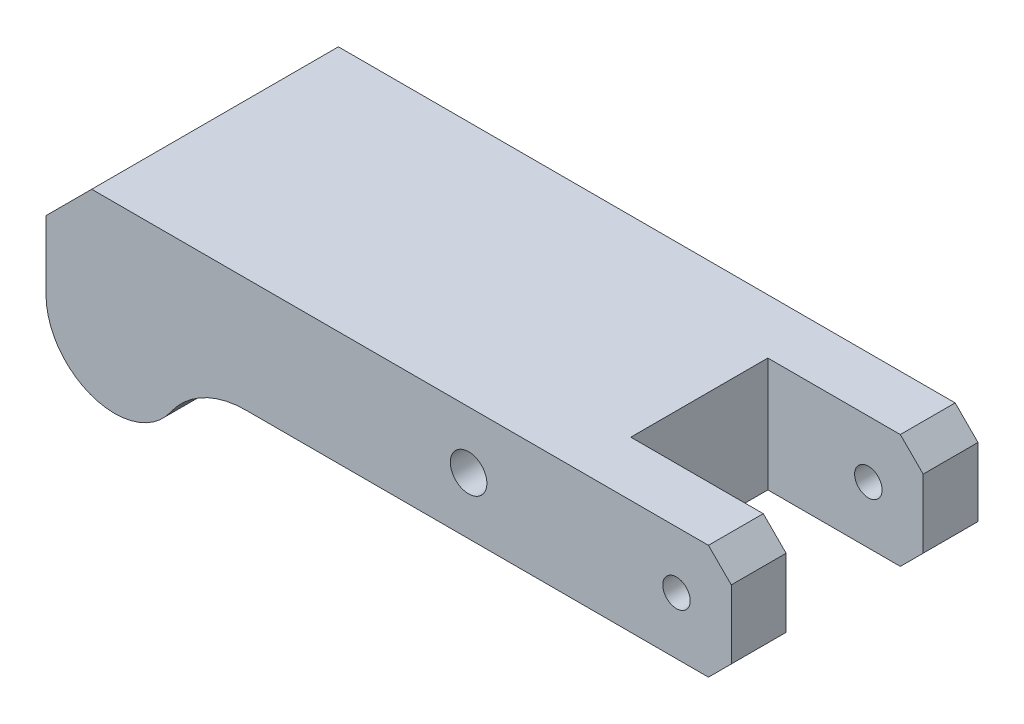
ISO-10303-21;
HEADER;
FILE_DESCRIPTION(('STEP AP214'),'2;1');
FILE_NAME('part.step','',(''),(''),'','','');
FILE_SCHEMA(('AUTOMOTIVE_DESIGN { 1 0 10303 214 1 1 1 1 }'));
ENDSEC;
DATA;
#1=APPLICATION_CONTEXT('core data for automotive mechanical design processes');
#2=APPLICATION_PROTOCOL_DEFINITION('international standard','automotive_design',2000,#1);
#3=PRODUCT_CONTEXT('',#1,'mechanical');
#4=PRODUCT('Part','Part','',(#3));
#5=PRODUCT_RELATED_PRODUCT_CATEGORY('part','',(#4));
#6=PRODUCT_DEFINITION_FORMATION('','',#4);
#7=PRODUCT_DEFINITION_CONTEXT('part definition',#1,'design');
#8=PRODUCT_DEFINITION('design','',#6,#7);
#9=PRODUCT_DEFINITION_SHAPE('','',#8);
#10=(LENGTH_UNIT() NAMED_UNIT(*) SI_UNIT(.MILLI.,.METRE.));
#11=(NAMED_UNIT(*) PLANE_ANGLE_UNIT() SI_UNIT($,.RADIAN.));
#12=(NAMED_UNIT(*) SI_UNIT($,.STERADIAN.) SOLID_ANGLE_UNIT());
#13=UNCERTAINTY_MEASURE_WITH_UNIT(LENGTH_MEASURE(1.E-05),#10,'distance_accuracy_value','');
#14=(GEOMETRIC_REPRESENTATION_CONTEXT(3) GLOBAL_UNCERTAINTY_ASSIGNED_CONTEXT((#13)) GLOBAL_UNIT_ASSIGNED_CONTEXT((#10,
#11,#12)) REPRESENTATION_CONTEXT('',''));
#15=CARTESIAN_POINT('',(0.,0.,0.));
#16=DIRECTION('',(0.,0.,1.));
#17=DIRECTION('',(1.,0.,0.));
#18=AXIS2_PLACEMENT_3D('',#15,#16,#17);
#19=CARTESIAN_POINT('',(130.,25.,-54.));
#20=DIRECTION('',(0.707106781186546,0.707106781186549,0.));
#21=DIRECTION('',(-0.707106781186549,0.707106781186546,0.));
#22=AXIS2_PLACEMENT_3D('',#19,#20,#21);
#23=PLANE('',#22);
#24=DIRECTION('',(0.707106781186549,-0.707106781186546,0.));
#25=VECTOR('',#24,1.);
#26=CARTESIAN_POINT('',(130.,25.,-12.));
#27=LINE('',#26,#25);
#28=CARTESIAN_POINT('',(130.,25.,-12.));
#29=VERTEX_POINT('',#28);
#30=CARTESIAN_POINT('',(135.,20.,-12.));
#31=VERTEX_POINT('',#30);
#32=EDGE_CURVE('E173',#29,#31,#27,.T.);
#33=ORIENTED_EDGE('',*,*,#32,.F.);
#34=DIRECTION('',(0.,0.,1.));
#35=VECTOR('',#34,1.);
#36=CARTESIAN_POINT('',(130.,25.,-54.));
#37=LINE('',#36,#35);
#38=CARTESIAN_POINT('',(130.,25.,0.));
#39=VERTEX_POINT('',#38);
#40=EDGE_CURVE('E214',#29,#39,#37,.T.);
#41=ORIENTED_EDGE('',*,*,#40,.T.);
#42=DIRECTION('',(-0.707106781186549,0.707106781186546,0.));
#43=VECTOR('',#42,1.);
#44=CARTESIAN_POINT('',(130.,25.,0.));
#45=LINE('',#44,#43);
#46=CARTESIAN_POINT('',(135.,20.,0.));
#47=VERTEX_POINT('',#46);
#48=EDGE_CURVE('E185',#47,#39,#45,.T.);
#49=ORIENTED_EDGE('',*,*,#48,.F.);
#50=DIRECTION('',(0.,0.,1.));
#51=VECTOR('',#50,1.);
#52=CARTESIAN_POINT('',(135.,20.,-54.));
#53=LINE('',#52,#51);
#54=EDGE_CURVE('E219',#31,#47,#53,.T.);
#55=ORIENTED_EDGE('',*,*,#54,.F.);
#56=EDGE_LOOP('',(#33,#41,#49,#55));
#57=FACE_BOUND('',#56,.T.);
#58=ADVANCED_FACE('F43',(#57),#23,.T.);
#59=CARTESIAN_POINT('',(135.,20.,-54.));
#60=DIRECTION('',(1.,0.,0.));
#61=DIRECTION('',(0.,0.,-1.));
#62=AXIS2_PLACEMENT_3D('',#59,#60,#61);
#63=PLANE('',#62);
#64=DIRECTION('',(0.,1.,0.));
#65=VECTOR('',#64,1.);
#66=CARTESIAN_POINT('',(135.,-29.,-12.));
#67=LINE('',#66,#65);
#68=CARTESIAN_POINT('',(135.,4.99999999999999,-12.));
#69=VERTEX_POINT('',#68);
#70=EDGE_CURVE('E264',#69,#31,#67,.T.);
#71=ORIENTED_EDGE('',*,*,#70,.T.);
#72=ORIENTED_EDGE('',*,*,#54,.T.);
#73=DIRECTION('',(0.,1.,0.));
#74=VECTOR('',#73,1.);
#75=CARTESIAN_POINT('',(135.,20.,0.));
#76=LINE('',#75,#74);
#77=CARTESIAN_POINT('',(135.,4.99999999999999,0.));
#78=VERTEX_POINT('',#77);
#79=EDGE_CURVE('E181',#78,#47,#76,.T.);
#80=ORIENTED_EDGE('',*,*,#79,.F.);
#81=DIRECTION('',(0.,0.,1.));
#82=VECTOR('',#81,1.);
#83=CARTESIAN_POINT('',(135.,4.99999999999999,-54.));
#84=LINE('',#83,#82);
#85=EDGE_CURVE('E224',#69,#78,#84,.T.);
#86=ORIENTED_EDGE('',*,*,#85,.F.);
#87=EDGE_LOOP('',(#71,#72,#80,#86));
#88=FACE_BOUND('',#87,.T.);
#89=ADVANCED_FACE('F351',(#88),#63,.T.);
#90=CARTESIAN_POINT('',(135.,4.99999999999999,-54.));
#91=DIRECTION('',(0.707106781186547,-0.707106781186548,0.));
#92=DIRECTION('',(0.707106781186548,0.707106781186547,0.));
#93=AXIS2_PLACEMENT_3D('',#90,#91,#92);
#94=PLANE('',#93);
#95=DIRECTION('',(-0.707106781186548,-0.707106781186547,0.));
#96=VECTOR('',#95,1.);
#97=CARTESIAN_POINT('',(135.,5.,-12.));
#98=LINE('',#97,#96);
#99=CARTESIAN_POINT('',(130.,0.,-12.));
#100=VERTEX_POINT('',#99);
#101=EDGE_CURVE('E268',#69,#100,#98,.T.);
#102=ORIENTED_EDGE('',*,*,#101,.F.);
#103=ORIENTED_EDGE('',*,*,#85,.T.);
#104=DIRECTION('',(0.707106781186548,0.707106781186547,0.));
#105=VECTOR('',#104,1.);
#106=CARTESIAN_POINT('',(135.,4.99999999999999,0.));
#107=LINE('',#106,#105);
#108=CARTESIAN_POINT('',(130.,0.,0.));
#109=VERTEX_POINT('',#108);
#110=EDGE_CURVE('E177',#109,#78,#107,.T.);
#111=ORIENTED_EDGE('',*,*,#110,.F.);
#112=DIRECTION('',(0.,0.,1.));
#113=VECTOR('',#112,1.);
#114=CARTESIAN_POINT('',(130.,0.,-54.));
#115=LINE('',#114,#113);
#116=EDGE_CURVE('E229',#100,#109,#115,.T.);
#117=ORIENTED_EDGE('',*,*,#116,.F.);
#118=EDGE_LOOP('',(#102,#103,#111,#117));
#119=FACE_BOUND('',#118,.T.);
#120=ADVANCED_FACE('F342',(#119),#94,.T.);
#121=CARTESIAN_POINT('',(28.7228132326901,-20.,-54.));
#122=DIRECTION('',(0.,0.,1.));
#123=DIRECTION('',(1.,0.,0.));
#124=AXIS2_PLACEMENT_3D('',#121,#122,#123);
#125=CYLINDRICAL_SURFACE('',#124,20.);
#126=CARTESIAN_POINT('',(28.7228132326901,-20.,0.));
#127=DIRECTION('',(0.,0.,-1.));
#128=DIRECTION('',(1.,0.,0.));
#129=AXIS2_PLACEMENT_3D('',#126,#127,#128);
#130=CIRCLE('',#129,20.);
#131=CARTESIAN_POINT('',(12.3097770997243,-8.57142857142859,0.));
#132=VERTEX_POINT('',#131);
#133=CARTESIAN_POINT('',(28.7228132326901,0.,0.));
#134=VERTEX_POINT('',#133);
#135=EDGE_CURVE('E168',#132,#134,#130,.T.);
#136=ORIENTED_EDGE('',*,*,#135,.F.);
#137=DIRECTION('',(0.,0.,1.));
#138=VECTOR('',#137,1.);
#139=CARTESIAN_POINT('',(12.3097770997243,-8.57142857142859,-54.));
#140=LINE('',#139,#138);
#141=CARTESIAN_POINT('',(12.3097770997243,-8.57142857142859,-54.));
#142=VERTEX_POINT('',#141);
#143=EDGE_CURVE('E69',#142,#132,#140,.T.);
#144=ORIENTED_EDGE('',*,*,#143,.F.);
#145=CARTESIAN_POINT('',(28.7228132326901,-20.,-54.));
#146=DIRECTION('',(0.,0.,-1.));
#147=DIRECTION('',(1.,0.,0.));
#148=AXIS2_PLACEMENT_3D('',#145,#146,#147);
#149=CIRCLE('',#148,20.);
#150=CARTESIAN_POINT('',(28.7228132326901,0.,-54.));
#151=VERTEX_POINT('',#150);
#152=EDGE_CURVE('E202',#142,#151,#149,.T.);
#153=ORIENTED_EDGE('',*,*,#152,.T.);
#154=DIRECTION('',(0.,0.,1.));
#155=VECTOR('',#154,1.);
#156=CARTESIAN_POINT('',(28.7228132326901,0.,-54.));
#157=LINE('',#156,#155);
#158=EDGE_CURVE('E111',#151,#134,#157,.T.);
#159=ORIENTED_EDGE('',*,*,#158,.T.);
#160=EDGE_LOOP('',(#136,#144,#153,#159));
#161=FACE_BOUND('',#160,.T.);
#162=ADVANCED_FACE('F45',(#161),#125,.F.);
#163=CARTESIAN_POINT('',(0.,0.,-54.));
#164=DIRECTION('',(0.,0.,1.));
#165=DIRECTION('',(1.,0.,0.));
#166=AXIS2_PLACEMENT_3D('',#163,#164,#165);
#167=CYLINDRICAL_SURFACE('',#166,15.);
#168=CARTESIAN_POINT('',(0.,0.,0.));
#169=DIRECTION('',(0.,0.,1.));
#170=DIRECTION('',(1.,0.,0.));
#171=AXIS2_PLACEMENT_3D('',#168,#169,#170);
#172=CIRCLE('',#171,15.);
#173=CARTESIAN_POINT('',(-15.,0.,0.));
#174=VERTEX_POINT('',#173);
#175=EDGE_CURVE('E198',#174,#132,#172,.T.);
#176=ORIENTED_EDGE('',*,*,#175,.F.);
#177=DIRECTION('',(0.,0.,1.));
#178=VECTOR('',#177,1.);
#179=CARTESIAN_POINT('',(-15.,0.,-54.));
#180=LINE('',#179,#178);
#181=CARTESIAN_POINT('',(-15.,0.,-54.));
#182=VERTEX_POINT('',#181);
#183=EDGE_CURVE('E145',#182,#174,#180,.T.);
#184=ORIENTED_EDGE('',*,*,#183,.F.);
#185=CARTESIAN_POINT('',(0.,0.,-54.));
#186=DIRECTION('',(0.,0.,1.));
#187=DIRECTION('',(1.,0.,0.));
#188=AXIS2_PLACEMENT_3D('',#185,#186,#187);
#189=CIRCLE('',#188,15.);
#190=EDGE_CURVE('E154',#182,#142,#189,.T.);
#191=ORIENTED_EDGE('',*,*,#190,.T.);
#192=ORIENTED_EDGE('',*,*,#143,.T.);
#193=EDGE_LOOP('',(#176,#184,#191,#192));
#194=FACE_BOUND('',#193,.T.);
#195=ADVANCED_FACE('F347',(#194),#167,.T.);
#196=CARTESIAN_POINT('',(-15.,0.,-54.));
#197=DIRECTION('',(-1.,0.,0.));
#198=DIRECTION('',(0.,0.,1.));
#199=AXIS2_PLACEMENT_3D('',#196,#197,#198);
#200=PLANE('',#199);
#201=DIRECTION('',(0.,-1.,0.));
#202=VECTOR('',#201,1.);
#203=CARTESIAN_POINT('',(-15.,0.,0.));
#204=LINE('',#203,#202);
#205=CARTESIAN_POINT('',(-15.,15.,0.));
#206=VERTEX_POINT('',#205);
#207=EDGE_CURVE('E139',#206,#174,#204,.T.);
#208=ORIENTED_EDGE('',*,*,#207,.F.);
#209=DIRECTION('',(0.,0.,1.));
#210=VECTOR('',#209,1.);
#211=CARTESIAN_POINT('',(-15.,15.,-54.));
#212=LINE('',#211,#210);
#213=CARTESIAN_POINT('',(-15.,15.,-54.));
#214=VERTEX_POINT('',#213);
#215=EDGE_CURVE('E133',#214,#206,#212,.T.);
#216=ORIENTED_EDGE('',*,*,#215,.F.);
#217=DIRECTION('',(0.,-1.,0.));
#218=VECTOR('',#217,1.);
#219=CARTESIAN_POINT('',(-15.,0.,-54.));
#220=LINE('',#219,#218);
#221=EDGE_CURVE('E136',#214,#182,#220,.T.);
#222=ORIENTED_EDGE('',*,*,#221,.T.);
#223=ORIENTED_EDGE('',*,*,#183,.T.);
#224=EDGE_LOOP('',(#208,#216,#222,#223));
#225=FACE_BOUND('',#224,.T.);
#226=ADVANCED_FACE('F135',(#225),#200,.T.);
#227=CARTESIAN_POINT('',(-15.,15.,-54.));
#228=DIRECTION('',(-0.707106781186549,0.707106781186546,0.));
#229=DIRECTION('',(-0.707106781186546,-0.707106781186549,0.));
#230=AXIS2_PLACEMENT_3D('',#227,#228,#229);
#231=PLANE('',#230);
#232=DIRECTION('',(-0.707106781186546,-0.707106781186549,0.));
#233=VECTOR('',#232,1.);
#234=CARTESIAN_POINT('',(-15.,15.,0.));
#235=LINE('',#234,#233);
#236=CARTESIAN_POINT('',(-5.00000000000004,25.,0.));
#237=VERTEX_POINT('',#236);
#238=EDGE_CURVE('E193',#237,#206,#235,.T.);
#239=ORIENTED_EDGE('',*,*,#238,.F.);
#240=DIRECTION('',(0.,0.,1.));
#241=VECTOR('',#240,1.);
#242=CARTESIAN_POINT('',(-5.00000000000004,25.,-54.));
#243=LINE('',#242,#241);
#244=CARTESIAN_POINT('',(-5.00000000000004,25.,-54.));
#245=VERTEX_POINT('',#244);
#246=EDGE_CURVE('E146',#245,#237,#243,.T.);
#247=ORIENTED_EDGE('',*,*,#246,.F.);
#248=DIRECTION('',(-0.707106781186546,-0.707106781186549,0.));
#249=VECTOR('',#248,1.);
#250=CARTESIAN_POINT('',(-15.,15.,-54.));
#251=LINE('',#250,#249);
#252=EDGE_CURVE('E152',#245,#214,#251,.T.);
#253=ORIENTED_EDGE('',*,*,#252,.T.);
#254=ORIENTED_EDGE('',*,*,#215,.T.);
#255=EDGE_LOOP('',(#239,#247,#253,#254));
#256=FACE_BOUND('',#255,.T.);
#257=ADVANCED_FACE('F157',(#256),#231,.T.);
#258=CARTESIAN_POINT('',(-5.00000000000004,25.,-54.));
#259=DIRECTION('',(0.,1.,0.));
#260=DIRECTION('',(-1.,0.,0.));
#261=AXIS2_PLACEMENT_3D('',#258,#259,#260);
#262=PLANE('',#261);
#263=DIRECTION('',(1.,0.,0.));
#264=VECTOR('',#263,1.);
#265=CARTESIAN_POINT('',(101.,25.,-12.));
#266=LINE('',#265,#264);
#267=CARTESIAN_POINT('',(101.,25.,-12.));
#268=VERTEX_POINT('',#267);
#269=EDGE_CURVE('E305',#268,#29,#266,.T.);
#270=ORIENTED_EDGE('',*,*,#269,.F.);
#271=DIRECTION('',(0.,0.,1.));
#272=VECTOR('',#271,1.);
#273=CARTESIAN_POINT('',(101.,25.,-42.));
#274=LINE('',#273,#272);
#275=CARTESIAN_POINT('',(101.,25.,-42.));
#276=VERTEX_POINT('',#275);
#277=EDGE_CURVE('E309',#276,#268,#274,.T.);
#278=ORIENTED_EDGE('',*,*,#277,.F.);
#279=DIRECTION('',(-1.,0.,0.));
#280=VECTOR('',#279,1.);
#281=CARTESIAN_POINT('',(101.,25.,-42.));
#282=LINE('',#281,#280);
#283=CARTESIAN_POINT('',(130.,25.,-42.));
#284=VERTEX_POINT('',#283);
#285=EDGE_CURVE('E316',#284,#276,#282,.T.);
#286=ORIENTED_EDGE('',*,*,#285,.F.);
#287=CARTESIAN_POINT('',(130.,25.,-54.));
#288=VERTEX_POINT('',#287);
#289=EDGE_CURVE('E210',#288,#284,#37,.T.);
#290=ORIENTED_EDGE('',*,*,#289,.F.);
#291=DIRECTION('',(-1.,0.,0.));
#292=VECTOR('',#291,1.);
#293=CARTESIAN_POINT('',(-5.00000000000004,25.,-54.));
#294=LINE('',#293,#292);
#295=EDGE_CURVE('E159',#288,#245,#294,.T.);
#296=ORIENTED_EDGE('',*,*,#295,.T.);
#297=ORIENTED_EDGE('',*,*,#246,.T.);
#298=DIRECTION('',(-1.,0.,0.));
#299=VECTOR('',#298,1.);
#300=CARTESIAN_POINT('',(-5.00000000000004,25.,0.));
#301=LINE('',#300,#299);
#302=EDGE_CURVE('E189',#39,#237,#301,.T.);
#303=ORIENTED_EDGE('',*,*,#302,.F.);
#304=ORIENTED_EDGE('',*,*,#40,.F.);
#305=EDGE_LOOP('',(#270,#278,#286,#290,#296,#297,#303,#304));
#306=FACE_BOUND('',#305,.T.);
#307=ADVANCED_FACE('F328',(#306),#262,.T.);
#308=DIRECTION('',(-0.707106781186549,0.707106781186546,0.));
#309=VECTOR('',#308,1.);
#310=CARTESIAN_POINT('',(130.,25.,-42.));
#311=LINE('',#310,#309);
#312=CARTESIAN_POINT('',(135.,20.,-42.));
#313=VERTEX_POINT('',#312);
#314=EDGE_CURVE('E263',#313,#284,#311,.T.);
#315=ORIENTED_EDGE('',*,*,#314,.F.);
#316=CARTESIAN_POINT('',(135.,20.,-54.));
#317=VERTEX_POINT('',#316);
#318=EDGE_CURVE('E215',#317,#313,#53,.T.);
#319=ORIENTED_EDGE('',*,*,#318,.F.);
#320=DIRECTION('',(-0.707106781186549,0.707106781186546,0.));
#321=VECTOR('',#320,1.);
#322=CARTESIAN_POINT('',(130.,25.,-54.));
#323=LINE('',#322,#321);
#324=EDGE_CURVE('E162',#317,#288,#323,.T.);
#325=ORIENTED_EDGE('',*,*,#324,.T.);
#326=ORIENTED_EDGE('',*,*,#289,.T.);
#327=EDGE_LOOP('',(#315,#319,#325,#326));
#328=FACE_BOUND('',#327,.T.);
#329=ADVANCED_FACE('F298',(#328),#23,.T.);
#330=DIRECTION('',(0.,1.,0.));
#331=VECTOR('',#330,1.);
#332=CARTESIAN_POINT('',(135.,-29.,-42.));
#333=LINE('',#332,#331);
#334=CARTESIAN_POINT('',(135.,4.99999999999999,-42.));
#335=VERTEX_POINT('',#334);
#336=EDGE_CURVE('E273',#335,#313,#333,.T.);
#337=ORIENTED_EDGE('',*,*,#336,.F.);
#338=CARTESIAN_POINT('',(135.,4.99999999999999,-54.));
#339=VERTEX_POINT('',#338);
#340=EDGE_CURVE('E220',#339,#335,#84,.T.);
#341=ORIENTED_EDGE('',*,*,#340,.F.);
#342=DIRECTION('',(0.,1.,0.));
#343=VECTOR('',#342,1.);
#344=CARTESIAN_POINT('',(135.,20.,-54.));
#345=LINE('',#344,#343);
#346=EDGE_CURVE('E290',#339,#317,#345,.T.);
#347=ORIENTED_EDGE('',*,*,#346,.T.);
#348=ORIENTED_EDGE('',*,*,#318,.T.);
#349=EDGE_LOOP('',(#337,#341,#347,#348));
#350=FACE_BOUND('',#349,.T.);
#351=ADVANCED_FACE('F302',(#350),#63,.T.);
#352=DIRECTION('',(0.707106781186548,0.707106781186547,0.));
#353=VECTOR('',#352,1.);
#354=CARTESIAN_POINT('',(135.,4.99999999999999,-42.));
#355=LINE('',#354,#353);
#356=CARTESIAN_POINT('',(130.,0.,-42.));
#357=VERTEX_POINT('',#356);
#358=EDGE_CURVE('E254',#357,#335,#355,.T.);
#359=ORIENTED_EDGE('',*,*,#358,.F.);
#360=CARTESIAN_POINT('',(130.,0.,-54.));
#361=VERTEX_POINT('',#360);
#362=EDGE_CURVE('E225',#361,#357,#115,.T.);
#363=ORIENTED_EDGE('',*,*,#362,.F.);
#364=DIRECTION('',(0.707106781186548,0.707106781186547,0.));
#365=VECTOR('',#364,1.);
#366=CARTESIAN_POINT('',(135.,4.99999999999999,-54.));
#367=LINE('',#366,#365);
#368=EDGE_CURVE('E287',#361,#339,#367,.T.);
#369=ORIENTED_EDGE('',*,*,#368,.T.);
#370=ORIENTED_EDGE('',*,*,#340,.T.);
#371=EDGE_LOOP('',(#359,#363,#369,#370));
#372=FACE_BOUND('',#371,.T.);
#373=ADVANCED_FACE('F259',(#372),#94,.T.);
#374=CARTESIAN_POINT('',(130.,0.,-54.));
#375=DIRECTION('',(0.,-1.,0.));
#376=DIRECTION('',(0.,0.,-1.));
#377=AXIS2_PLACEMENT_3D('',#374,#375,#376);
#378=PLANE('',#377);
#379=DIRECTION('',(-1.,0.,0.));
#380=VECTOR('',#379,1.);
#381=CARTESIAN_POINT('',(130.,0.,-12.));
#382=LINE('',#381,#380);
#383=CARTESIAN_POINT('',(101.,0.,-12.));
#384=VERTEX_POINT('',#383);
#385=EDGE_CURVE('E11',#100,#384,#382,.T.);
#386=ORIENTED_EDGE('',*,*,#385,.F.);
#387=ORIENTED_EDGE('',*,*,#116,.T.);
#388=DIRECTION('',(1.,0.,0.));
#389=VECTOR('',#388,1.);
#390=CARTESIAN_POINT('',(130.,0.,0.));
#391=LINE('',#390,#389);
#392=EDGE_CURVE('E172',#134,#109,#391,.T.);
#393=ORIENTED_EDGE('',*,*,#392,.F.);
#394=ORIENTED_EDGE('',*,*,#158,.F.);
#395=DIRECTION('',(1.,0.,0.));
#396=VECTOR('',#395,1.);
#397=CARTESIAN_POINT('',(130.,0.,-54.));
#398=LINE('',#397,#396);
#399=EDGE_CURVE('E284',#151,#361,#398,.T.);
#400=ORIENTED_EDGE('',*,*,#399,.T.);
#401=ORIENTED_EDGE('',*,*,#362,.T.);
#402=DIRECTION('',(1.,0.,0.));
#403=VECTOR('',#402,1.);
#404=CARTESIAN_POINT('',(130.,0.,-42.));
#405=LINE('',#404,#403);
#406=CARTESIAN_POINT('',(101.,0.,-42.));
#407=VERTEX_POINT('',#406);
#408=EDGE_CURVE('E205',#407,#357,#405,.T.);
#409=ORIENTED_EDGE('',*,*,#408,.F.);
#410=DIRECTION('',(0.,0.,-1.));
#411=VECTOR('',#410,1.);
#412=CARTESIAN_POINT('',(101.,0.,-54.));
#413=LINE('',#412,#411);
#414=EDGE_CURVE('E53',#384,#407,#413,.T.);
#415=ORIENTED_EDGE('',*,*,#414,.F.);
#416=EDGE_LOOP('',(#386,#387,#393,#394,#400,#401,#409,#415));
#417=FACE_BOUND('',#416,.T.);
#418=ADVANCED_FACE('F246',(#417),#378,.T.);
#419=CARTESIAN_POINT('',(28.7228132326901,-20.,-54.));
#420=DIRECTION('',(0.,0.,1.));
#421=DIRECTION('',(1.,0.,0.));
#422=AXIS2_PLACEMENT_3D('',#419,#420,#421);
#423=PLANE('',#422);
#424=CARTESIAN_POINT('',(123.,12.5,-54.));
#425=DIRECTION('',(0.,0.,1.));
#426=DIRECTION('',(1.,0.,0.));
#427=AXIS2_PLACEMENT_3D('',#424,#425,#426);
#428=CIRCLE('',#427,3.00000000000001);
#429=CARTESIAN_POINT('',(126.,12.5,-54.));
#430=VERTEX_POINT('',#429);
#431=EDGE_CURVE('E376',#430,#430,#428,.T.);
#432=ORIENTED_EDGE('',*,*,#431,.T.);
#433=EDGE_LOOP('',(#432));
#434=FACE_BOUND('',#433,.T.);
#435=CARTESIAN_POINT('',(77.5,12.5,-54.));
#436=DIRECTION('',(0.,0.,1.));
#437=DIRECTION('',(1.,0.,0.));
#438=AXIS2_PLACEMENT_3D('',#435,#436,#437);
#439=CIRCLE('',#438,4.00000000000001);
#440=CARTESIAN_POINT('',(81.5,12.5,-54.));
#441=VERTEX_POINT('',#440);
#442=EDGE_CURVE('E364',#441,#441,#439,.T.);
#443=ORIENTED_EDGE('',*,*,#442,.T.);
#444=EDGE_LOOP('',(#443));
#445=FACE_BOUND('',#444,.T.);
#446=ORIENTED_EDGE('',*,*,#152,.F.);
#447=ORIENTED_EDGE('',*,*,#190,.F.);
#448=ORIENTED_EDGE('',*,*,#221,.F.);
#449=ORIENTED_EDGE('',*,*,#252,.F.);
#450=ORIENTED_EDGE('',*,*,#295,.F.);
#451=ORIENTED_EDGE('',*,*,#324,.F.);
#452=ORIENTED_EDGE('',*,*,#346,.F.);
#453=ORIENTED_EDGE('',*,*,#368,.F.);
#454=ORIENTED_EDGE('',*,*,#399,.F.);
#455=EDGE_LOOP('',(#446,#447,#448,#449,#450,#451,#452,#453,#454));
#456=FACE_BOUND('',#455,.T.);
#457=ADVANCED_FACE('F150',(#434,#445,#456),#423,.F.);
#458=CARTESIAN_POINT('',(28.7228132326901,-20.,0.));
#459=DIRECTION('',(0.,0.,1.));
#460=DIRECTION('',(1.,0.,0.));
#461=AXIS2_PLACEMENT_3D('',#458,#459,#460);
#462=PLANE('',#461);
#463=CARTESIAN_POINT('',(123.,12.5,0.));
#464=DIRECTION('',(0.,0.,1.));
#465=DIRECTION('',(1.,0.,0.));
#466=AXIS2_PLACEMENT_3D('',#463,#464,#465);
#467=CIRCLE('',#466,3.00000000000001);
#468=CARTESIAN_POINT('',(126.,12.5,0.));
#469=VERTEX_POINT('',#468);
#470=EDGE_CURVE('E372',#469,#469,#467,.T.);
#471=ORIENTED_EDGE('',*,*,#470,.F.);
#472=EDGE_LOOP('',(#471));
#473=FACE_BOUND('',#472,.T.);
#474=CARTESIAN_POINT('',(77.5,12.5,0.));
#475=DIRECTION('',(0.,0.,1.));
#476=DIRECTION('',(1.,0.,0.));
#477=AXIS2_PLACEMENT_3D('',#474,#475,#476);
#478=CIRCLE('',#477,4.00000000000001);
#479=CARTESIAN_POINT('',(81.5,12.5,0.));
#480=VERTEX_POINT('',#479);
#481=EDGE_CURVE('E368',#480,#480,#478,.T.);
#482=ORIENTED_EDGE('',*,*,#481,.F.);
#483=EDGE_LOOP('',(#482));
#484=FACE_BOUND('',#483,.T.);
#485=ORIENTED_EDGE('',*,*,#135,.T.);
#486=ORIENTED_EDGE('',*,*,#392,.T.);
#487=ORIENTED_EDGE('',*,*,#110,.T.);
#488=ORIENTED_EDGE('',*,*,#79,.T.);
#489=ORIENTED_EDGE('',*,*,#48,.T.);
#490=ORIENTED_EDGE('',*,*,#302,.T.);
#491=ORIENTED_EDGE('',*,*,#238,.T.);
#492=ORIENTED_EDGE('',*,*,#207,.T.);
#493=ORIENTED_EDGE('',*,*,#175,.T.);
#494=EDGE_LOOP('',(#485,#486,#487,#488,#489,#490,#491,#492,#493));
#495=FACE_BOUND('',#494,.T.);
#496=ADVANCED_FACE('F346',(#473,#484,#495),#462,.T.);
#497=CARTESIAN_POINT('',(101.,-29.,-12.));
#498=DIRECTION('',(0.,0.,1.));
#499=DIRECTION('',(1.,0.,0.));
#500=AXIS2_PLACEMENT_3D('',#497,#498,#499);
#501=PLANE('',#500);
#502=CARTESIAN_POINT('',(123.,12.5,-12.));
#503=DIRECTION('',(0.,0.,1.));
#504=DIRECTION('',(1.,0.,0.));
#505=AXIS2_PLACEMENT_3D('',#502,#503,#504);
#506=CIRCLE('',#505,3.00000000000001);
#507=CARTESIAN_POINT('',(126.,12.5,-12.));
#508=VERTEX_POINT('',#507);
#509=EDGE_CURVE('E359',#508,#508,#506,.T.);
#510=ORIENTED_EDGE('',*,*,#509,.T.);
#511=EDGE_LOOP('',(#510));
#512=FACE_BOUND('',#511,.T.);
#513=ORIENTED_EDGE('',*,*,#32,.T.);
#514=ORIENTED_EDGE('',*,*,#70,.F.);
#515=ORIENTED_EDGE('',*,*,#101,.T.);
#516=ORIENTED_EDGE('',*,*,#385,.T.);
#517=DIRECTION('',(0.,1.,0.));
#518=VECTOR('',#517,1.);
#519=CARTESIAN_POINT('',(101.,-29.,-12.));
#520=LINE('',#519,#518);
#521=EDGE_CURVE('E244',#384,#268,#520,.T.);
#522=ORIENTED_EDGE('',*,*,#521,.T.);
#523=ORIENTED_EDGE('',*,*,#269,.T.);
#524=EDGE_LOOP('',(#513,#514,#515,#516,#522,#523));
#525=FACE_BOUND('',#524,.T.);
#526=ADVANCED_FACE('F322',(#512,#525),#501,.F.);
#527=CARTESIAN_POINT('',(101.,-29.,-42.));
#528=DIRECTION('',(-1.,0.,0.));
#529=DIRECTION('',(0.,-1.,0.));
#530=AXIS2_PLACEMENT_3D('',#527,#528,#529);
#531=PLANE('',#530);
#532=ORIENTED_EDGE('',*,*,#414,.T.);
#533=DIRECTION('',(0.,1.,0.));
#534=VECTOR('',#533,1.);
#535=CARTESIAN_POINT('',(101.,-29.,-42.));
#536=LINE('',#535,#534);
#537=EDGE_CURVE('E60',#407,#276,#536,.T.);
#538=ORIENTED_EDGE('',*,*,#537,.T.);
#539=ORIENTED_EDGE('',*,*,#277,.T.);
#540=ORIENTED_EDGE('',*,*,#521,.F.);
#541=EDGE_LOOP('',(#532,#538,#539,#540));
#542=FACE_BOUND('',#541,.T.);
#543=ADVANCED_FACE('F239',(#542),#531,.F.);
#544=CARTESIAN_POINT('',(101.,-29.,-42.));
#545=DIRECTION('',(0.,0.,-1.));
#546=DIRECTION('',(-1.,0.,0.));
#547=AXIS2_PLACEMENT_3D('',#544,#545,#546);
#548=PLANE('',#547);
#549=CARTESIAN_POINT('',(123.,12.5,-42.));
#550=DIRECTION('',(0.,0.,-1.));
#551=DIRECTION('',(-1.,0.,0.));
#552=AXIS2_PLACEMENT_3D('',#549,#550,#551);
#553=CIRCLE('',#552,3.00000000000001);
#554=CARTESIAN_POINT('',(120.,12.5,-42.));
#555=VERTEX_POINT('',#554);
#556=EDGE_CURVE('E47',#555,#555,#553,.T.);
#557=ORIENTED_EDGE('',*,*,#556,.T.);
#558=EDGE_LOOP('',(#557));
#559=FACE_BOUND('',#558,.T.);
#560=ORIENTED_EDGE('',*,*,#314,.T.);
#561=ORIENTED_EDGE('',*,*,#285,.T.);
#562=ORIENTED_EDGE('',*,*,#537,.F.);
#563=ORIENTED_EDGE('',*,*,#408,.T.);
#564=ORIENTED_EDGE('',*,*,#358,.T.);
#565=ORIENTED_EDGE('',*,*,#336,.T.);
#566=EDGE_LOOP('',(#560,#561,#562,#563,#564,#565));
#567=FACE_BOUND('',#566,.T.);
#568=ADVANCED_FACE('F251',(#559,#567),#548,.F.);
#569=CARTESIAN_POINT('',(123.,12.5,-54.));
#570=DIRECTION('',(0.,0.,1.));
#571=DIRECTION('',(1.,0.,0.));
#572=AXIS2_PLACEMENT_3D('',#569,#570,#571);
#573=CYLINDRICAL_SURFACE('',#572,3.00000000000001);
#574=ORIENTED_EDGE('',*,*,#431,.F.);
#575=EDGE_LOOP('',(#574));
#576=FACE_BOUND('',#575,.T.);
#577=ORIENTED_EDGE('',*,*,#556,.F.);
#578=EDGE_LOOP('',(#577));
#579=FACE_BOUND('',#578,.T.);
#580=ADVANCED_FACE('F386',(#576,#579),#573,.F.);
#581=ORIENTED_EDGE('',*,*,#470,.T.);
#582=EDGE_LOOP('',(#581));
#583=FACE_BOUND('',#582,.T.);
#584=ORIENTED_EDGE('',*,*,#509,.F.);
#585=EDGE_LOOP('',(#584));
#586=FACE_BOUND('',#585,.T.);
#587=ADVANCED_FACE('F388',(#583,#586),#573,.F.);
#588=CARTESIAN_POINT('',(77.5,12.5,-54.));
#589=DIRECTION('',(0.,0.,1.));
#590=DIRECTION('',(1.,0.,0.));
#591=AXIS2_PLACEMENT_3D('',#588,#589,#590);
#592=CYLINDRICAL_SURFACE('',#591,4.00000000000001);
#593=ORIENTED_EDGE('',*,*,#442,.F.);
#594=EDGE_LOOP('',(#593));
#595=FACE_BOUND('',#594,.T.);
#596=ORIENTED_EDGE('',*,*,#481,.T.);
#597=EDGE_LOOP('',(#596));
#598=FACE_BOUND('',#597,.T.);
#599=ADVANCED_FACE('F395',(#595,#598),#592,.F.);
#600=CLOSED_SHELL('',(#58,#89,#120,#162,#195,#226,#257,#307,#329,#351,#373,#418,#457,#496,#526,
#543,#568,#580,#587,#599));
#601=MANIFOLD_SOLID_BREP('B2',#600);
#602=ADVANCED_BREP_SHAPE_REPRESENTATION('',(#18,#601),#14);
#603=SHAPE_DEFINITION_REPRESENTATION(#9,#602);
ENDSEC;
END-ISO-10303-21;
